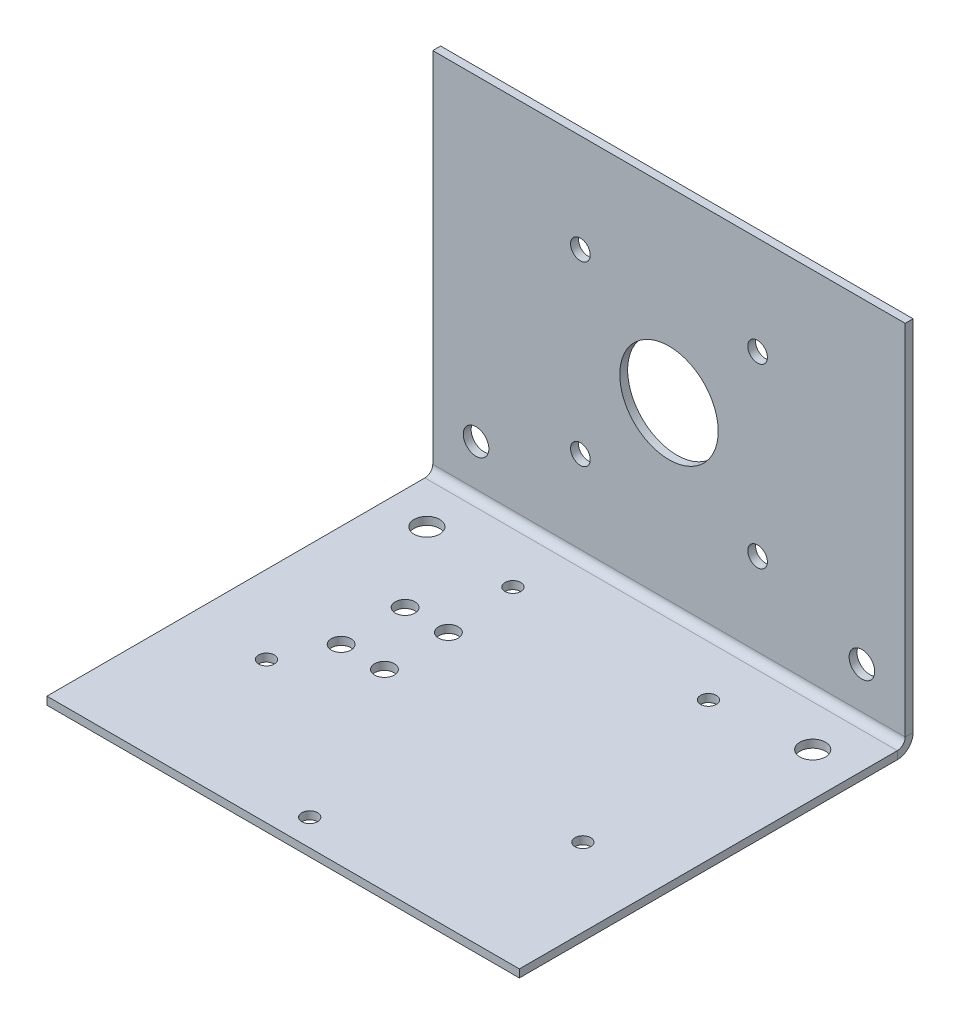
ISO-10303-21;
HEADER;
FILE_DESCRIPTION(('STEP AP214'),'2;1');
FILE_NAME('part.step','',(''),(''),'','','');
FILE_SCHEMA(('AUTOMOTIVE_DESIGN { 1 0 10303 214 1 1 1 1 }'));
ENDSEC;
DATA;
#1=APPLICATION_CONTEXT('core data for automotive mechanical design processes');
#2=APPLICATION_PROTOCOL_DEFINITION('international standard','automotive_design',2000,#1);
#3=PRODUCT_CONTEXT('',#1,'mechanical');
#4=PRODUCT('Part','Part','',(#3));
#5=PRODUCT_RELATED_PRODUCT_CATEGORY('part','',(#4));
#6=PRODUCT_DEFINITION_FORMATION('','',#4);
#7=PRODUCT_DEFINITION_CONTEXT('part definition',#1,'design');
#8=PRODUCT_DEFINITION('design','',#6,#7);
#9=PRODUCT_DEFINITION_SHAPE('','',#8);
#10=(LENGTH_UNIT() NAMED_UNIT(*) SI_UNIT(.MILLI.,.METRE.));
#11=(NAMED_UNIT(*) PLANE_ANGLE_UNIT() SI_UNIT($,.RADIAN.));
#12=(NAMED_UNIT(*) SI_UNIT($,.STERADIAN.) SOLID_ANGLE_UNIT());
#13=UNCERTAINTY_MEASURE_WITH_UNIT(LENGTH_MEASURE(1.E-05),#10,'distance_accuracy_value','');
#14=(GEOMETRIC_REPRESENTATION_CONTEXT(3) GLOBAL_UNCERTAINTY_ASSIGNED_CONTEXT((#13)) GLOBAL_UNIT_ASSIGNED_CONTEXT((#10,
#11,#12)) REPRESENTATION_CONTEXT('',''));
#15=CARTESIAN_POINT('',(0.,0.,0.));
#16=DIRECTION('',(0.,0.,1.));
#17=DIRECTION('',(1.,0.,0.));
#18=AXIS2_PLACEMENT_3D('',#15,#16,#17);
#19=CARTESIAN_POINT('',(120.,0.,-2.));
#20=DIRECTION('',(1.,0.,0.));
#21=DIRECTION('',(0.,0.,-1.));
#22=AXIS2_PLACEMENT_3D('',#19,#20,#21);
#23=PLANE('',#22);
#24=DIRECTION('',(0.,1.,0.));
#25=VECTOR('',#24,1.);
#26=CARTESIAN_POINT('',(120.,0.,0.));
#27=LINE('',#26,#25);
#28=CARTESIAN_POINT('',(120.,4.00000000000001,0.));
#29=VERTEX_POINT('',#28);
#30=CARTESIAN_POINT('',(120.,95.,0.));
#31=VERTEX_POINT('',#30);
#32=EDGE_CURVE('E130',#29,#31,#27,.T.);
#33=ORIENTED_EDGE('',*,*,#32,.F.);
#34=DIRECTION('',(0.,0.,-1.));
#35=VECTOR('',#34,1.);
#36=CARTESIAN_POINT('',(120.,4.00000000000001,0.));
#37=LINE('',#36,#35);
#38=CARTESIAN_POINT('',(120.,4.00000000000002,-2.00000000000001));
#39=VERTEX_POINT('',#38);
#40=EDGE_CURVE('E185',#29,#39,#37,.T.);
#41=ORIENTED_EDGE('',*,*,#40,.T.);
#42=DIRECTION('',(0.,1.,0.));
#43=VECTOR('',#42,1.);
#44=CARTESIAN_POINT('',(120.,0.,-2.));
#45=LINE('',#44,#43);
#46=CARTESIAN_POINT('',(120.,95.,-2.));
#47=VERTEX_POINT('',#46);
#48=EDGE_CURVE('E138',#39,#47,#45,.T.);
#49=ORIENTED_EDGE('',*,*,#48,.T.);
#50=DIRECTION('',(0.,0.,1.));
#51=VECTOR('',#50,1.);
#52=CARTESIAN_POINT('',(120.,95.,-2.));
#53=LINE('',#52,#51);
#54=EDGE_CURVE('E86',#47,#31,#53,.T.);
#55=ORIENTED_EDGE('',*,*,#54,.T.);
#56=EDGE_LOOP('',(#33,#41,#49,#55));
#57=FACE_BOUND('',#56,.T.);
#58=ADVANCED_FACE('F82',(#57),#23,.T.);
#59=CARTESIAN_POINT('',(0.,0.,-2.));
#60=DIRECTION('',(0.,0.,-1.));
#61=DIRECTION('',(-1.,0.,0.));
#62=AXIS2_PLACEMENT_3D('',#59,#60,#61);
#63=PLANE('',#62);
#64=CARTESIAN_POINT('',(109.,14.5,-2.));
#65=DIRECTION('',(0.,0.,1.));
#66=DIRECTION('',(-1.,0.,0.));
#67=AXIS2_PLACEMENT_3D('',#64,#65,#66);
#68=CIRCLE('',#67,3.25000000000001);
#69=CARTESIAN_POINT('',(105.75,14.5,-2.));
#70=VERTEX_POINT('',#69);
#71=EDGE_CURVE('E177',#70,#70,#68,.T.);
#72=ORIENTED_EDGE('',*,*,#71,.T.);
#73=EDGE_LOOP('',(#72));
#74=FACE_BOUND('',#73,.T.);
#75=CARTESIAN_POINT('',(11.,14.5,-2.));
#76=DIRECTION('',(0.,0.,1.));
#77=DIRECTION('',(1.,0.,0.));
#78=AXIS2_PLACEMENT_3D('',#75,#76,#77);
#79=CIRCLE('',#78,3.25);
#80=CARTESIAN_POINT('',(14.25,14.5,-2.));
#81=VERTEX_POINT('',#80);
#82=EDGE_CURVE('E171',#81,#81,#79,.T.);
#83=ORIENTED_EDGE('',*,*,#82,.T.);
#84=EDGE_LOOP('',(#83));
#85=FACE_BOUND('',#84,.T.);
#86=CARTESIAN_POINT('',(82.5,25.,-2.));
#87=DIRECTION('',(0.,0.,1.));
#88=DIRECTION('',(1.,0.,0.));
#89=AXIS2_PLACEMENT_3D('',#86,#87,#88);
#90=CIRCLE('',#89,2.49999999999999);
#91=CARTESIAN_POINT('',(85.,25.,-2.));
#92=VERTEX_POINT('',#91);
#93=EDGE_CURVE('E165',#92,#92,#90,.T.);
#94=ORIENTED_EDGE('',*,*,#93,.T.);
#95=EDGE_LOOP('',(#94));
#96=FACE_BOUND('',#95,.T.);
#97=CARTESIAN_POINT('',(37.5,25.,-2.));
#98=DIRECTION('',(0.,0.,1.));
#99=DIRECTION('',(1.,0.,0.));
#100=AXIS2_PLACEMENT_3D('',#97,#98,#99);
#101=CIRCLE('',#100,2.49999999999999);
#102=CARTESIAN_POINT('',(40.,25.,-2.));
#103=VERTEX_POINT('',#102);
#104=EDGE_CURVE('E159',#103,#103,#101,.T.);
#105=ORIENTED_EDGE('',*,*,#104,.T.);
#106=EDGE_LOOP('',(#105));
#107=FACE_BOUND('',#106,.T.);
#108=CARTESIAN_POINT('',(37.5,70.,-2.));
#109=DIRECTION('',(0.,0.,1.));
#110=DIRECTION('',(1.,0.,0.));
#111=AXIS2_PLACEMENT_3D('',#108,#109,#110);
#112=CIRCLE('',#111,2.5);
#113=CARTESIAN_POINT('',(40.,70.,-2.));
#114=VERTEX_POINT('',#113);
#115=EDGE_CURVE('E153',#114,#114,#112,.T.);
#116=ORIENTED_EDGE('',*,*,#115,.T.);
#117=EDGE_LOOP('',(#116));
#118=FACE_BOUND('',#117,.T.);
#119=CARTESIAN_POINT('',(82.5,70.,-2.));
#120=DIRECTION('',(0.,0.,1.));
#121=DIRECTION('',(1.,0.,0.));
#122=AXIS2_PLACEMENT_3D('',#119,#120,#121);
#123=CIRCLE('',#122,2.5);
#124=CARTESIAN_POINT('',(85.,70.,-2.));
#125=VERTEX_POINT('',#124);
#126=EDGE_CURVE('E147',#125,#125,#123,.T.);
#127=ORIENTED_EDGE('',*,*,#126,.T.);
#128=EDGE_LOOP('',(#127));
#129=FACE_BOUND('',#128,.T.);
#130=CARTESIAN_POINT('',(60.,47.5,-2.));
#131=DIRECTION('',(0.,0.,1.));
#132=DIRECTION('',(1.,0.,0.));
#133=AXIS2_PLACEMENT_3D('',#130,#131,#132);
#134=CIRCLE('',#133,12.5);
#135=CARTESIAN_POINT('',(72.5,47.5,-2.));
#136=VERTEX_POINT('',#135);
#137=EDGE_CURVE('E131',#136,#136,#134,.T.);
#138=ORIENTED_EDGE('',*,*,#137,.T.);
#139=EDGE_LOOP('',(#138));
#140=FACE_BOUND('',#139,.T.);
#141=ORIENTED_EDGE('',*,*,#48,.F.);
#142=DIRECTION('',(1.,0.,0.));
#143=VECTOR('',#142,1.);
#144=CARTESIAN_POINT('',(120.,4.00000000000002,-2.00000000000001));
#145=LINE('',#144,#143);
#146=CARTESIAN_POINT('',(0.,4.00000000000003,-2.));
#147=VERTEX_POINT('',#146);
#148=EDGE_CURVE('E202',#39,#147,#145,.F.);
#149=ORIENTED_EDGE('',*,*,#148,.T.);
#150=DIRECTION('',(0.,-1.,0.));
#151=VECTOR('',#150,1.);
#152=CARTESIAN_POINT('',(0.,0.,-2.));
#153=LINE('',#152,#151);
#154=CARTESIAN_POINT('',(0.,95.,-2.));
#155=VERTEX_POINT('',#154);
#156=EDGE_CURVE('E136',#155,#147,#153,.T.);
#157=ORIENTED_EDGE('',*,*,#156,.F.);
#158=DIRECTION('',(-1.,0.,0.));
#159=VECTOR('',#158,1.);
#160=CARTESIAN_POINT('',(0.,95.,-2.));
#161=LINE('',#160,#159);
#162=EDGE_CURVE('E122',#47,#155,#161,.T.);
#163=ORIENTED_EDGE('',*,*,#162,.F.);
#164=EDGE_LOOP('',(#141,#149,#157,#163));
#165=FACE_BOUND('',#164,.T.);
#166=ADVANCED_FACE('F358',(#74,#85,#96,#107,#118,#129,#140,#165),#63,.T.);
#167=CARTESIAN_POINT('',(0.,0.,0.));
#168=DIRECTION('',(0.,0.,-1.));
#169=DIRECTION('',(-1.,0.,0.));
#170=AXIS2_PLACEMENT_3D('',#167,#168,#169);
#171=PLANE('',#170);
#172=CARTESIAN_POINT('',(60.,47.5,0.));
#173=DIRECTION('',(0.,0.,1.));
#174=DIRECTION('',(1.,0.,0.));
#175=AXIS2_PLACEMENT_3D('',#172,#173,#174);
#176=CIRCLE('',#175,12.5);
#177=CARTESIAN_POINT('',(72.5,47.5,0.));
#178=VERTEX_POINT('',#177);
#179=EDGE_CURVE('E144',#178,#178,#176,.T.);
#180=ORIENTED_EDGE('',*,*,#179,.F.);
#181=EDGE_LOOP('',(#180));
#182=FACE_BOUND('',#181,.T.);
#183=CARTESIAN_POINT('',(82.5,70.,0.));
#184=DIRECTION('',(0.,0.,1.));
#185=DIRECTION('',(1.,0.,0.));
#186=AXIS2_PLACEMENT_3D('',#183,#184,#185);
#187=CIRCLE('',#186,2.5);
#188=CARTESIAN_POINT('',(85.,70.,0.));
#189=VERTEX_POINT('',#188);
#190=EDGE_CURVE('E150',#189,#189,#187,.T.);
#191=ORIENTED_EDGE('',*,*,#190,.F.);
#192=EDGE_LOOP('',(#191));
#193=FACE_BOUND('',#192,.T.);
#194=CARTESIAN_POINT('',(37.5,70.,0.));
#195=DIRECTION('',(0.,0.,1.));
#196=DIRECTION('',(1.,0.,0.));
#197=AXIS2_PLACEMENT_3D('',#194,#195,#196);
#198=CIRCLE('',#197,2.5);
#199=CARTESIAN_POINT('',(40.,70.,0.));
#200=VERTEX_POINT('',#199);
#201=EDGE_CURVE('E156',#200,#200,#198,.T.);
#202=ORIENTED_EDGE('',*,*,#201,.F.);
#203=EDGE_LOOP('',(#202));
#204=FACE_BOUND('',#203,.T.);
#205=CARTESIAN_POINT('',(37.5,25.,0.));
#206=DIRECTION('',(0.,0.,1.));
#207=DIRECTION('',(1.,0.,0.));
#208=AXIS2_PLACEMENT_3D('',#205,#206,#207);
#209=CIRCLE('',#208,2.49999999999999);
#210=CARTESIAN_POINT('',(40.,25.,0.));
#211=VERTEX_POINT('',#210);
#212=EDGE_CURVE('E162',#211,#211,#209,.T.);
#213=ORIENTED_EDGE('',*,*,#212,.F.);
#214=EDGE_LOOP('',(#213));
#215=FACE_BOUND('',#214,.T.);
#216=CARTESIAN_POINT('',(82.5,25.,0.));
#217=DIRECTION('',(0.,0.,1.));
#218=DIRECTION('',(1.,0.,0.));
#219=AXIS2_PLACEMENT_3D('',#216,#217,#218);
#220=CIRCLE('',#219,2.49999999999999);
#221=CARTESIAN_POINT('',(85.,25.,0.));
#222=VERTEX_POINT('',#221);
#223=EDGE_CURVE('E168',#222,#222,#220,.T.);
#224=ORIENTED_EDGE('',*,*,#223,.F.);
#225=EDGE_LOOP('',(#224));
#226=FACE_BOUND('',#225,.T.);
#227=CARTESIAN_POINT('',(11.,14.5,0.));
#228=DIRECTION('',(0.,0.,1.));
#229=DIRECTION('',(1.,0.,0.));
#230=AXIS2_PLACEMENT_3D('',#227,#228,#229);
#231=CIRCLE('',#230,3.25);
#232=CARTESIAN_POINT('',(14.25,14.5,0.));
#233=VERTEX_POINT('',#232);
#234=EDGE_CURVE('E174',#233,#233,#231,.T.);
#235=ORIENTED_EDGE('',*,*,#234,.F.);
#236=EDGE_LOOP('',(#235));
#237=FACE_BOUND('',#236,.T.);
#238=CARTESIAN_POINT('',(109.,14.5,0.));
#239=DIRECTION('',(0.,0.,1.));
#240=DIRECTION('',(-1.,0.,0.));
#241=AXIS2_PLACEMENT_3D('',#238,#239,#240);
#242=CIRCLE('',#241,3.25000000000001);
#243=CARTESIAN_POINT('',(105.75,14.5,0.));
#244=VERTEX_POINT('',#243);
#245=EDGE_CURVE('E180',#244,#244,#242,.T.);
#246=ORIENTED_EDGE('',*,*,#245,.F.);
#247=EDGE_LOOP('',(#246));
#248=FACE_BOUND('',#247,.T.);
#249=DIRECTION('',(1.,0.,0.));
#250=VECTOR('',#249,1.);
#251=CARTESIAN_POINT('',(120.,4.00000000000001,0.));
#252=LINE('',#251,#250);
#253=CARTESIAN_POINT('',(0.,4.00000000000001,0.));
#254=VERTEX_POINT('',#253);
#255=EDGE_CURVE('E192',#29,#254,#252,.F.);
#256=ORIENTED_EDGE('',*,*,#255,.F.);
#257=ORIENTED_EDGE('',*,*,#32,.T.);
#258=DIRECTION('',(-1.,0.,0.));
#259=VECTOR('',#258,1.);
#260=CARTESIAN_POINT('',(0.,95.,0.));
#261=LINE('',#260,#259);
#262=CARTESIAN_POINT('',(0.,95.,0.));
#263=VERTEX_POINT('',#262);
#264=EDGE_CURVE('E120',#31,#263,#261,.T.);
#265=ORIENTED_EDGE('',*,*,#264,.T.);
#266=DIRECTION('',(0.,-1.,0.));
#267=VECTOR('',#266,1.);
#268=CARTESIAN_POINT('',(0.,0.,0.));
#269=LINE('',#268,#267);
#270=EDGE_CURVE('E125',#263,#254,#269,.T.);
#271=ORIENTED_EDGE('',*,*,#270,.T.);
#272=EDGE_LOOP('',(#256,#257,#265,#271));
#273=FACE_BOUND('',#272,.T.);
#274=ADVANCED_FACE('F133',(#182,#193,#204,#215,#226,#237,#248,#273),#171,.F.);
#275=CARTESIAN_POINT('',(0.,0.,-2.));
#276=DIRECTION('',(-1.,0.,0.));
#277=DIRECTION('',(0.,0.,1.));
#278=AXIS2_PLACEMENT_3D('',#275,#276,#277);
#279=PLANE('',#278);
#280=DIRECTION('',(0.,0.,-1.));
#281=VECTOR('',#280,1.);
#282=CARTESIAN_POINT('',(0.,4.00000000000001,0.));
#283=LINE('',#282,#281);
#284=EDGE_CURVE('E127',#254,#147,#283,.T.);
#285=ORIENTED_EDGE('',*,*,#284,.F.);
#286=ORIENTED_EDGE('',*,*,#270,.F.);
#287=DIRECTION('',(0.,0.,1.));
#288=VECTOR('',#287,1.);
#289=CARTESIAN_POINT('',(0.,95.,-2.));
#290=LINE('',#289,#288);
#291=EDGE_CURVE('E13',#155,#263,#290,.T.);
#292=ORIENTED_EDGE('',*,*,#291,.F.);
#293=ORIENTED_EDGE('',*,*,#156,.T.);
#294=EDGE_LOOP('',(#285,#286,#292,#293));
#295=FACE_BOUND('',#294,.T.);
#296=ADVANCED_FACE('F84',(#295),#279,.T.);
#297=CARTESIAN_POINT('',(0.,95.,-2.));
#298=DIRECTION('',(0.,1.,0.));
#299=DIRECTION('',(0.,0.,1.));
#300=AXIS2_PLACEMENT_3D('',#297,#298,#299);
#301=PLANE('',#300);
#302=ORIENTED_EDGE('',*,*,#264,.F.);
#303=ORIENTED_EDGE('',*,*,#54,.F.);
#304=ORIENTED_EDGE('',*,*,#162,.T.);
#305=ORIENTED_EDGE('',*,*,#291,.T.);
#306=EDGE_LOOP('',(#302,#303,#304,#305));
#307=FACE_BOUND('',#306,.T.);
#308=ADVANCED_FACE('F117',(#307),#301,.T.);
#309=CARTESIAN_POINT('',(60.,47.5,-2.));
#310=DIRECTION('',(0.,0.,1.));
#311=DIRECTION('',(1.,0.,0.));
#312=AXIS2_PLACEMENT_3D('',#309,#310,#311);
#313=CYLINDRICAL_SURFACE('',#312,12.5);
#314=ORIENTED_EDGE('',*,*,#137,.F.);
#315=EDGE_LOOP('',(#314));
#316=FACE_BOUND('',#315,.T.);
#317=ORIENTED_EDGE('',*,*,#179,.T.);
#318=EDGE_LOOP('',(#317));
#319=FACE_BOUND('',#318,.T.);
#320=ADVANCED_FACE('F382',(#316,#319),#313,.F.);
#321=CARTESIAN_POINT('',(82.5,70.,-2.));
#322=DIRECTION('',(0.,0.,1.));
#323=DIRECTION('',(1.,0.,0.));
#324=AXIS2_PLACEMENT_3D('',#321,#322,#323);
#325=CYLINDRICAL_SURFACE('',#324,2.5);
#326=ORIENTED_EDGE('',*,*,#126,.F.);
#327=EDGE_LOOP('',(#326));
#328=FACE_BOUND('',#327,.T.);
#329=ORIENTED_EDGE('',*,*,#190,.T.);
#330=EDGE_LOOP('',(#329));
#331=FACE_BOUND('',#330,.T.);
#332=ADVANCED_FACE('F388',(#328,#331),#325,.F.);
#333=CARTESIAN_POINT('',(37.5,70.,-2.));
#334=DIRECTION('',(0.,0.,1.));
#335=DIRECTION('',(1.,0.,0.));
#336=AXIS2_PLACEMENT_3D('',#333,#334,#335);
#337=CYLINDRICAL_SURFACE('',#336,2.5);
#338=ORIENTED_EDGE('',*,*,#115,.F.);
#339=EDGE_LOOP('',(#338));
#340=FACE_BOUND('',#339,.T.);
#341=ORIENTED_EDGE('',*,*,#201,.T.);
#342=EDGE_LOOP('',(#341));
#343=FACE_BOUND('',#342,.T.);
#344=ADVANCED_FACE('F392',(#340,#343),#337,.F.);
#345=CARTESIAN_POINT('',(37.5,25.,-2.));
#346=DIRECTION('',(0.,0.,1.));
#347=DIRECTION('',(1.,0.,0.));
#348=AXIS2_PLACEMENT_3D('',#345,#346,#347);
#349=CYLINDRICAL_SURFACE('',#348,2.49999999999999);
#350=ORIENTED_EDGE('',*,*,#104,.F.);
#351=EDGE_LOOP('',(#350));
#352=FACE_BOUND('',#351,.T.);
#353=ORIENTED_EDGE('',*,*,#212,.T.);
#354=EDGE_LOOP('',(#353));
#355=FACE_BOUND('',#354,.T.);
#356=ADVANCED_FACE('F396',(#352,#355),#349,.F.);
#357=CARTESIAN_POINT('',(82.5,25.,-2.));
#358=DIRECTION('',(0.,0.,1.));
#359=DIRECTION('',(1.,0.,0.));
#360=AXIS2_PLACEMENT_3D('',#357,#358,#359);
#361=CYLINDRICAL_SURFACE('',#360,2.49999999999999);
#362=ORIENTED_EDGE('',*,*,#93,.F.);
#363=EDGE_LOOP('',(#362));
#364=FACE_BOUND('',#363,.T.);
#365=ORIENTED_EDGE('',*,*,#223,.T.);
#366=EDGE_LOOP('',(#365));
#367=FACE_BOUND('',#366,.T.);
#368=ADVANCED_FACE('F400',(#364,#367),#361,.F.);
#369=CARTESIAN_POINT('',(11.,14.5,-2.));
#370=DIRECTION('',(0.,0.,1.));
#371=DIRECTION('',(1.,0.,0.));
#372=AXIS2_PLACEMENT_3D('',#369,#370,#371);
#373=CYLINDRICAL_SURFACE('',#372,3.25);
#374=ORIENTED_EDGE('',*,*,#82,.F.);
#375=EDGE_LOOP('',(#374));
#376=FACE_BOUND('',#375,.T.);
#377=ORIENTED_EDGE('',*,*,#234,.T.);
#378=EDGE_LOOP('',(#377));
#379=FACE_BOUND('',#378,.T.);
#380=ADVANCED_FACE('F369',(#376,#379),#373,.F.);
#381=CARTESIAN_POINT('',(109.,14.5,-2.));
#382=DIRECTION('',(0.,0.,1.));
#383=DIRECTION('',(1.,0.,0.));
#384=AXIS2_PLACEMENT_3D('',#381,#382,#383);
#385=CYLINDRICAL_SURFACE('',#384,3.25000000000001);
#386=ORIENTED_EDGE('',*,*,#71,.F.);
#387=EDGE_LOOP('',(#386));
#388=FACE_BOUND('',#387,.T.);
#389=ORIENTED_EDGE('',*,*,#245,.T.);
#390=EDGE_LOOP('',(#389));
#391=FACE_BOUND('',#390,.T.);
#392=ADVANCED_FACE('F362',(#388,#391),#385,.F.);
#393=CARTESIAN_POINT('',(0.,4.,2.));
#394=DIRECTION('',(-1.,0.,0.));
#395=DIRECTION('',(0.,0.,1.));
#396=AXIS2_PLACEMENT_3D('',#393,#394,#395);
#397=PLANE('',#396);
#398=DIRECTION('',(0.,1.,0.));
#399=VECTOR('',#398,1.);
#400=CARTESIAN_POINT('',(0.,0.,1.99999999999999));
#401=LINE('',#400,#399);
#402=CARTESIAN_POINT('',(0.,1.99999999999999,1.99999999999999));
#403=VERTEX_POINT('',#402);
#404=CARTESIAN_POINT('',(0.,0.,1.99999999999998));
#405=VERTEX_POINT('',#404);
#406=EDGE_CURVE('E206',#403,#405,#401,.F.);
#407=ORIENTED_EDGE('',*,*,#406,.F.);
#408=CARTESIAN_POINT('',(0.,4.,2.));
#409=DIRECTION('',(1.,0.,0.));
#410=DIRECTION('',(0.,0.,-1.));
#411=AXIS2_PLACEMENT_3D('',#408,#409,#410);
#412=CIRCLE('',#411,2.00000000000001);
#413=EDGE_CURVE('E196',#254,#403,#412,.F.);
#414=ORIENTED_EDGE('',*,*,#413,.F.);
#415=ORIENTED_EDGE('',*,*,#284,.T.);
#416=CARTESIAN_POINT('',(0.,4.,2.));
#417=DIRECTION('',(1.,0.,0.));
#418=DIRECTION('',(0.,0.,-1.));
#419=AXIS2_PLACEMENT_3D('',#416,#417,#418);
#420=CIRCLE('',#419,4.00000000000001);
#421=EDGE_CURVE('E97',#147,#405,#420,.F.);
#422=ORIENTED_EDGE('',*,*,#421,.T.);
#423=EDGE_LOOP('',(#407,#414,#415,#422));
#424=FACE_BOUND('',#423,.T.);
#425=ADVANCED_FACE('F360',(#424),#397,.T.);
#426=CARTESIAN_POINT('',(120.,4.,2.));
#427=DIRECTION('',(-1.,0.,0.));
#428=DIRECTION('',(0.,0.,1.));
#429=AXIS2_PLACEMENT_3D('',#426,#427,#428);
#430=PLANE('',#429);
#431=CARTESIAN_POINT('',(120.,4.,2.));
#432=DIRECTION('',(1.,0.,0.));
#433=DIRECTION('',(0.,0.,-1.));
#434=AXIS2_PLACEMENT_3D('',#431,#432,#433);
#435=CIRCLE('',#434,2.00000000000001);
#436=CARTESIAN_POINT('',(120.,1.99999999999999,1.99999999999999));
#437=VERTEX_POINT('',#436);
#438=EDGE_CURVE('E189',#437,#29,#435,.T.);
#439=ORIENTED_EDGE('',*,*,#438,.F.);
#440=DIRECTION('',(0.,1.,0.));
#441=VECTOR('',#440,1.);
#442=CARTESIAN_POINT('',(120.,2.00000000000001,1.99999999999999));
#443=LINE('',#442,#441);
#444=CARTESIAN_POINT('',(120.,0.,1.99999999999998));
#445=VERTEX_POINT('',#444);
#446=EDGE_CURVE('E212',#437,#445,#443,.F.);
#447=ORIENTED_EDGE('',*,*,#446,.T.);
#448=CARTESIAN_POINT('',(120.,4.,2.));
#449=DIRECTION('',(1.,0.,0.));
#450=DIRECTION('',(0.,0.,-1.));
#451=AXIS2_PLACEMENT_3D('',#448,#449,#450);
#452=CIRCLE('',#451,4.00000000000001);
#453=EDGE_CURVE('E199',#445,#39,#452,.T.);
#454=ORIENTED_EDGE('',*,*,#453,.T.);
#455=ORIENTED_EDGE('',*,*,#40,.F.);
#456=EDGE_LOOP('',(#439,#447,#454,#455));
#457=FACE_BOUND('',#456,.T.);
#458=ADVANCED_FACE('F352',(#457),#430,.F.);
#459=CARTESIAN_POINT('',(120.,4.,2.));
#460=DIRECTION('',(1.,0.,0.));
#461=DIRECTION('',(0.,-1.,0.));
#462=AXIS2_PLACEMENT_3D('',#459,#460,#461);
#463=CYLINDRICAL_SURFACE('',#462,4.00000000000001);
#464=ORIENTED_EDGE('',*,*,#148,.F.);
#465=ORIENTED_EDGE('',*,*,#453,.F.);
#466=DIRECTION('',(1.,0.,0.));
#467=VECTOR('',#466,1.);
#468=CARTESIAN_POINT('',(0.,0.,1.99999999999999));
#469=LINE('',#468,#467);
#470=EDGE_CURVE('E215',#445,#405,#469,.F.);
#471=ORIENTED_EDGE('',*,*,#470,.T.);
#472=ORIENTED_EDGE('',*,*,#421,.F.);
#473=EDGE_LOOP('',(#464,#465,#471,#472));
#474=FACE_BOUND('',#473,.T.);
#475=ADVANCED_FACE('F359',(#474),#463,.T.);
#476=CARTESIAN_POINT('',(120.,4.,2.));
#477=DIRECTION('',(1.,0.,0.));
#478=DIRECTION('',(0.,-1.,0.));
#479=AXIS2_PLACEMENT_3D('',#476,#477,#478);
#480=CYLINDRICAL_SURFACE('',#479,2.00000000000001);
#481=ORIENTED_EDGE('',*,*,#255,.T.);
#482=ORIENTED_EDGE('',*,*,#413,.T.);
#483=DIRECTION('',(1.,0.,0.));
#484=VECTOR('',#483,1.);
#485=CARTESIAN_POINT('',(0.,1.99999999999999,1.99999999999999));
#486=LINE('',#485,#484);
#487=EDGE_CURVE('E209',#403,#437,#486,.T.);
#488=ORIENTED_EDGE('',*,*,#487,.T.);
#489=ORIENTED_EDGE('',*,*,#438,.T.);
#490=EDGE_LOOP('',(#481,#482,#488,#489));
#491=FACE_BOUND('',#490,.T.);
#492=ADVANCED_FACE('F354',(#491),#480,.F.);
#493=CARTESIAN_POINT('',(0.,0.,0.));
#494=DIRECTION('',(0.,1.,0.));
#495=DIRECTION('',(0.,0.,1.));
#496=AXIS2_PLACEMENT_3D('',#493,#494,#495);
#497=PLANE('',#496);
#498=CARTESIAN_POINT('',(25.98,-1.67448644347437E-13,49.25));
#499=DIRECTION('',(0.,1.,0.));
#500=DIRECTION('',(0.,0.,1.));
#501=AXIS2_PLACEMENT_3D('',#498,#499,#500);
#502=CIRCLE('',#501,2.50000000000001);
#503=CARTESIAN_POINT('',(25.98,-1.76177347694544E-13,51.75));
#504=VERTEX_POINT('',#503);
#505=EDGE_CURVE('E220',#504,#504,#502,.F.);
#506=ORIENTED_EDGE('',*,*,#505,.F.);
#507=EDGE_LOOP('',(#506));
#508=FACE_BOUND('',#507,.T.);
#509=CARTESIAN_POINT('',(36.98,-1.65540448523862E-13,49.25));
#510=DIRECTION('',(0.,1.,0.));
#511=DIRECTION('',(0.,0.,1.));
#512=AXIS2_PLACEMENT_3D('',#509,#510,#511);
#513=CIRCLE('',#512,2.5);
#514=CARTESIAN_POINT('',(36.98,-1.7426915187097E-13,51.75));
#515=VERTEX_POINT('',#514);
#516=EDGE_CURVE('E226',#515,#515,#513,.F.);
#517=ORIENTED_EDGE('',*,*,#516,.F.);
#518=EDGE_LOOP('',(#517));
#519=FACE_BOUND('',#518,.T.);
#520=CARTESIAN_POINT('',(25.98,-1.10712072591236E-13,33.));
#521=DIRECTION('',(0.,1.,0.));
#522=DIRECTION('',(0.,0.,1.));
#523=AXIS2_PLACEMENT_3D('',#520,#521,#522);
#524=CIRCLE('',#523,2.50000000000001);
#525=CARTESIAN_POINT('',(25.98,-1.19440775938344E-13,35.5));
#526=VERTEX_POINT('',#525);
#527=EDGE_CURVE('E232',#526,#526,#524,.F.);
#528=ORIENTED_EDGE('',*,*,#527,.F.);
#529=EDGE_LOOP('',(#528));
#530=FACE_BOUND('',#529,.T.);
#531=CARTESIAN_POINT('',(36.98,-1.08803876767661E-13,33.));
#532=DIRECTION('',(0.,1.,0.));
#533=DIRECTION('',(0.,0.,1.));
#534=AXIS2_PLACEMENT_3D('',#531,#532,#533);
#535=CIRCLE('',#534,2.5);
#536=CARTESIAN_POINT('',(36.98,-1.17532580114769E-13,35.5));
#537=VERTEX_POINT('',#536);
#538=EDGE_CURVE('E238',#537,#537,#535,.F.);
#539=ORIENTED_EDGE('',*,*,#538,.F.);
#540=EDGE_LOOP('',(#539));
#541=FACE_BOUND('',#540,.T.);
#542=CARTESIAN_POINT('',(11.,0.,12.5));
#543=DIRECTION('',(0.,1.,0.));
#544=DIRECTION('',(0.,0.,1.));
#545=AXIS2_PLACEMENT_3D('',#542,#543,#544);
#546=CIRCLE('',#545,3.25000000000001);
#547=CARTESIAN_POINT('',(11.,0.,15.75));
#548=VERTEX_POINT('',#547);
#549=EDGE_CURVE('E244',#548,#548,#546,.F.);
#550=ORIENTED_EDGE('',*,*,#549,.F.);
#551=EDGE_LOOP('',(#550));
#552=FACE_BOUND('',#551,.T.);
#553=CARTESIAN_POINT('',(109.,0.,12.5));
#554=DIRECTION('',(0.,1.,0.));
#555=DIRECTION('',(0.,0.,1.));
#556=AXIS2_PLACEMENT_3D('',#553,#554,#555);
#557=CIRCLE('',#556,3.25000000000001);
#558=CARTESIAN_POINT('',(109.,0.,15.75));
#559=VERTEX_POINT('',#558);
#560=EDGE_CURVE('E250',#559,#559,#557,.F.);
#561=ORIENTED_EDGE('',*,*,#560,.F.);
#562=EDGE_LOOP('',(#561));
#563=FACE_BOUND('',#562,.T.);
#564=CARTESIAN_POINT('',(19.8178621865298,-2.13229403201072E-13,62.0559680123415));
#565=DIRECTION('',(0.,1.,0.));
#566=DIRECTION('',(0.,0.,1.));
#567=AXIS2_PLACEMENT_3D('',#564,#565,#566);
#568=CIRCLE('',#567,2.);
#569=CARTESIAN_POINT('',(19.8178621865298,-2.20212365878758E-13,64.0559680123415));
#570=VERTEX_POINT('',#569);
#571=EDGE_CURVE('E256',#570,#570,#568,.F.);
#572=ORIENTED_EDGE('',*,*,#571,.F.);
#573=EDGE_LOOP('',(#572));
#574=FACE_BOUND('',#573,.T.);
#575=CARTESIAN_POINT('',(35.166073090643,0.,14.8190319876585));
#576=DIRECTION('',(0.,1.,0.));
#577=DIRECTION('',(0.,0.,1.));
#578=AXIS2_PLACEMENT_3D('',#575,#576,#577);
#579=CIRCLE('',#578,2.);
#580=CARTESIAN_POINT('',(35.166073090643,0.,16.8190319876585));
#581=VERTEX_POINT('',#580);
#582=EDGE_CURVE('E262',#581,#581,#579,.F.);
#583=ORIENTED_EDGE('',*,*,#582,.F.);
#584=EDGE_LOOP('',(#583));
#585=FACE_BOUND('',#584,.T.);
#586=CARTESIAN_POINT('',(84.833926909357,0.,14.8190319876585));
#587=DIRECTION('',(0.,1.,0.));
#588=DIRECTION('',(0.,0.,1.));
#589=AXIS2_PLACEMENT_3D('',#586,#587,#588);
#590=CIRCLE('',#589,2.);
#591=CARTESIAN_POINT('',(84.833926909357,0.,16.8190319876585));
#592=VERTEX_POINT('',#591);
#593=EDGE_CURVE('E268',#592,#592,#590,.F.);
#594=ORIENTED_EDGE('',*,*,#593,.F.);
#595=EDGE_LOOP('',(#594));
#596=FACE_BOUND('',#595,.T.);
#597=CARTESIAN_POINT('',(100.18213781347,-1.9928842364508E-13,62.0559680123415));
#598=DIRECTION('',(0.,1.,0.));
#599=DIRECTION('',(0.,0.,1.));
#600=AXIS2_PLACEMENT_3D('',#597,#598,#599);
#601=CIRCLE('',#600,2.);
#602=CARTESIAN_POINT('',(100.18213781347,-2.06271386322766E-13,64.0559680123415));
#603=VERTEX_POINT('',#602);
#604=EDGE_CURVE('E274',#603,#603,#601,.F.);
#605=ORIENTED_EDGE('',*,*,#604,.F.);
#606=EDGE_LOOP('',(#605));
#607=FACE_BOUND('',#606,.T.);
#608=CARTESIAN_POINT('',(60.,-3.08189331313575E-13,91.25));
#609=DIRECTION('',(0.,1.,0.));
#610=DIRECTION('',(0.,0.,1.));
#611=AXIS2_PLACEMENT_3D('',#608,#609,#610);
#612=CIRCLE('',#611,2.00000000000001);
#613=CARTESIAN_POINT('',(60.,-3.15172293991261E-13,93.25));
#614=VERTEX_POINT('',#613);
#615=EDGE_CURVE('E280',#614,#614,#612,.F.);
#616=ORIENTED_EDGE('',*,*,#615,.F.);
#617=EDGE_LOOP('',(#616));
#618=FACE_BOUND('',#617,.T.);
#619=ORIENTED_EDGE('',*,*,#470,.F.);
#620=DIRECTION('',(0.,0.,1.));
#621=VECTOR('',#620,1.);
#622=CARTESIAN_POINT('',(120.,0.,0.));
#623=LINE('',#622,#621);
#624=CARTESIAN_POINT('',(120.,-3.21348489494905E-13,98.));
#625=VERTEX_POINT('',#624);
#626=EDGE_CURVE('E295',#445,#625,#623,.T.);
#627=ORIENTED_EDGE('',*,*,#626,.T.);
#628=DIRECTION('',(-1.,0.,0.));
#629=VECTOR('',#628,1.);
#630=CARTESIAN_POINT('',(0.,-3.42165171206627E-13,98.));
#631=LINE('',#630,#629);
#632=CARTESIAN_POINT('',(0.,-3.42165171206627E-13,98.));
#633=VERTEX_POINT('',#632);
#634=EDGE_CURVE('E298',#625,#633,#631,.T.);
#635=ORIENTED_EDGE('',*,*,#634,.T.);
#636=DIRECTION('',(0.,0.,-1.));
#637=VECTOR('',#636,1.);
#638=CARTESIAN_POINT('',(0.,0.,0.));
#639=LINE('',#638,#637);
#640=EDGE_CURVE('E292',#633,#405,#639,.T.);
#641=ORIENTED_EDGE('',*,*,#640,.T.);
#642=EDGE_LOOP('',(#619,#627,#635,#641));
#643=FACE_BOUND('',#642,.T.);
#644=ADVANCED_FACE('F347',(#508,#519,#530,#541,#552,#563,#574,#585,#596,#607,#618,#643),#497,.F.);
#645=CARTESIAN_POINT('',(0.,2.,0.));
#646=DIRECTION('',(0.,1.,0.));
#647=DIRECTION('',(0.,0.,1.));
#648=AXIS2_PLACEMENT_3D('',#645,#646,#647);
#649=PLANE('',#648);
#650=CARTESIAN_POINT('',(36.98,1.99999999999983,49.25));
#651=DIRECTION('',(0.,1.,0.));
#652=DIRECTION('',(0.,0.,1.));
#653=AXIS2_PLACEMENT_3D('',#650,#651,#652);
#654=CIRCLE('',#653,2.5);
#655=CARTESIAN_POINT('',(36.98,1.99999999999983,51.75));
#656=VERTEX_POINT('',#655);
#657=EDGE_CURVE('E223',#656,#656,#654,.F.);
#658=ORIENTED_EDGE('',*,*,#657,.T.);
#659=EDGE_LOOP('',(#658));
#660=FACE_BOUND('',#659,.T.);
#661=CARTESIAN_POINT('',(36.98,1.99999999999989,33.));
#662=DIRECTION('',(0.,1.,0.));
#663=DIRECTION('',(0.,0.,1.));
#664=AXIS2_PLACEMENT_3D('',#661,#662,#663);
#665=CIRCLE('',#664,2.5);
#666=CARTESIAN_POINT('',(36.98,1.99999999999988,35.5));
#667=VERTEX_POINT('',#666);
#668=EDGE_CURVE('E235',#667,#667,#665,.F.);
#669=ORIENTED_EDGE('',*,*,#668,.T.);
#670=EDGE_LOOP('',(#669));
#671=FACE_BOUND('',#670,.T.);
#672=CARTESIAN_POINT('',(109.,1.99999999999998,12.5));
#673=DIRECTION('',(0.,1.,0.));
#674=DIRECTION('',(0.,0.,1.));
#675=AXIS2_PLACEMENT_3D('',#672,#673,#674);
#676=CIRCLE('',#675,3.25000000000001);
#677=CARTESIAN_POINT('',(109.,1.99999999999996,15.75));
#678=VERTEX_POINT('',#677);
#679=EDGE_CURVE('E247',#678,#678,#676,.F.);
#680=ORIENTED_EDGE('',*,*,#679,.T.);
#681=EDGE_LOOP('',(#680));
#682=FACE_BOUND('',#681,.T.);
#683=CARTESIAN_POINT('',(35.166073090643,1.99999999999995,14.8190319876585));
#684=DIRECTION('',(0.,1.,0.));
#685=DIRECTION('',(0.,0.,1.));
#686=AXIS2_PLACEMENT_3D('',#683,#684,#685);
#687=CIRCLE('',#686,2.);
#688=CARTESIAN_POINT('',(35.166073090643,1.99999999999995,16.8190319876585));
#689=VERTEX_POINT('',#688);
#690=EDGE_CURVE('E259',#689,#689,#687,.F.);
#691=ORIENTED_EDGE('',*,*,#690,.T.);
#692=EDGE_LOOP('',(#691));
#693=FACE_BOUND('',#692,.T.);
#694=CARTESIAN_POINT('',(100.18213781347,1.9999999999998,62.0559680123415));
#695=DIRECTION('',(0.,1.,0.));
#696=DIRECTION('',(0.,0.,1.));
#697=AXIS2_PLACEMENT_3D('',#694,#695,#696);
#698=CIRCLE('',#697,2.);
#699=CARTESIAN_POINT('',(100.18213781347,1.99999999999979,64.0559680123415));
#700=VERTEX_POINT('',#699);
#701=EDGE_CURVE('E271',#700,#700,#698,.F.);
#702=ORIENTED_EDGE('',*,*,#701,.T.);
#703=EDGE_LOOP('',(#702));
#704=FACE_BOUND('',#703,.T.);
#705=CARTESIAN_POINT('',(60.,1.99999999999969,91.25));
#706=DIRECTION('',(0.,1.,0.));
#707=DIRECTION('',(0.,0.,1.));
#708=AXIS2_PLACEMENT_3D('',#705,#706,#707);
#709=CIRCLE('',#708,2.00000000000001);
#710=CARTESIAN_POINT('',(60.,1.99999999999968,93.25));
#711=VERTEX_POINT('',#710);
#712=EDGE_CURVE('E277',#711,#711,#709,.F.);
#713=ORIENTED_EDGE('',*,*,#712,.T.);
#714=EDGE_LOOP('',(#713));
#715=FACE_BOUND('',#714,.T.);
#716=CARTESIAN_POINT('',(84.833926909357,1.99999999999996,14.8190319876585));
#717=DIRECTION('',(0.,1.,0.));
#718=DIRECTION('',(0.,0.,1.));
#719=AXIS2_PLACEMENT_3D('',#716,#717,#718);
#720=CIRCLE('',#719,2.);
#721=CARTESIAN_POINT('',(84.833926909357,1.99999999999996,16.8190319876585));
#722=VERTEX_POINT('',#721);
#723=EDGE_CURVE('E265',#722,#722,#720,.F.);
#724=ORIENTED_EDGE('',*,*,#723,.T.);
#725=EDGE_LOOP('',(#724));
#726=FACE_BOUND('',#725,.T.);
#727=CARTESIAN_POINT('',(19.8178621865298,1.99999999999979,62.0559680123415));
#728=DIRECTION('',(0.,1.,0.));
#729=DIRECTION('',(0.,0.,1.));
#730=AXIS2_PLACEMENT_3D('',#727,#728,#729);
#731=CIRCLE('',#730,2.);
#732=CARTESIAN_POINT('',(19.8178621865298,1.99999999999978,64.0559680123415));
#733=VERTEX_POINT('',#732);
#734=EDGE_CURVE('E253',#733,#733,#731,.F.);
#735=ORIENTED_EDGE('',*,*,#734,.T.);
#736=EDGE_LOOP('',(#735));
#737=FACE_BOUND('',#736,.T.);
#738=CARTESIAN_POINT('',(11.,1.99999999999996,12.5));
#739=DIRECTION('',(0.,1.,0.));
#740=DIRECTION('',(0.,0.,1.));
#741=AXIS2_PLACEMENT_3D('',#738,#739,#740);
#742=CIRCLE('',#741,3.25000000000001);
#743=CARTESIAN_POINT('',(11.,1.99999999999995,15.75));
#744=VERTEX_POINT('',#743);
#745=EDGE_CURVE('E241',#744,#744,#742,.F.);
#746=ORIENTED_EDGE('',*,*,#745,.T.);
#747=EDGE_LOOP('',(#746));
#748=FACE_BOUND('',#747,.T.);
#749=CARTESIAN_POINT('',(25.98,1.99999999999989,33.));
#750=DIRECTION('',(0.,1.,0.));
#751=DIRECTION('',(0.,0.,1.));
#752=AXIS2_PLACEMENT_3D('',#749,#750,#751);
#753=CIRCLE('',#752,2.50000000000001);
#754=CARTESIAN_POINT('',(25.98,1.99999999999988,35.5));
#755=VERTEX_POINT('',#754);
#756=EDGE_CURVE('E229',#755,#755,#753,.F.);
#757=ORIENTED_EDGE('',*,*,#756,.T.);
#758=EDGE_LOOP('',(#757));
#759=FACE_BOUND('',#758,.T.);
#760=CARTESIAN_POINT('',(25.98,1.99999999999983,49.25));
#761=DIRECTION('',(0.,1.,0.));
#762=DIRECTION('',(0.,0.,1.));
#763=AXIS2_PLACEMENT_3D('',#760,#761,#762);
#764=CIRCLE('',#763,2.50000000000001);
#765=CARTESIAN_POINT('',(25.98,1.99999999999982,51.75));
#766=VERTEX_POINT('',#765);
#767=EDGE_CURVE('E217',#766,#766,#764,.F.);
#768=ORIENTED_EDGE('',*,*,#767,.T.);
#769=EDGE_LOOP('',(#768));
#770=FACE_BOUND('',#769,.T.);
#771=DIRECTION('',(0.,0.,-1.));
#772=VECTOR('',#771,1.);
#773=CARTESIAN_POINT('',(120.,1.99999999999968,98.));
#774=LINE('',#773,#772);
#775=CARTESIAN_POINT('',(120.,1.99999999999968,98.));
#776=VERTEX_POINT('',#775);
#777=EDGE_CURVE('E286',#437,#776,#774,.F.);
#778=ORIENTED_EDGE('',*,*,#777,.F.);
#779=ORIENTED_EDGE('',*,*,#487,.F.);
#780=DIRECTION('',(0.,0.,1.));
#781=VECTOR('',#780,1.);
#782=CARTESIAN_POINT('',(0.,2.,0.));
#783=LINE('',#782,#781);
#784=CARTESIAN_POINT('',(0.,1.99999999999966,98.));
#785=VERTEX_POINT('',#784);
#786=EDGE_CURVE('E283',#785,#403,#783,.F.);
#787=ORIENTED_EDGE('',*,*,#786,.F.);
#788=DIRECTION('',(1.,0.,0.));
#789=VECTOR('',#788,1.);
#790=CARTESIAN_POINT('',(0.,1.99999999999966,98.));
#791=LINE('',#790,#789);
#792=EDGE_CURVE('E289',#776,#785,#791,.F.);
#793=ORIENTED_EDGE('',*,*,#792,.F.);
#794=EDGE_LOOP('',(#778,#779,#787,#793));
#795=FACE_BOUND('',#794,.T.);
#796=ADVANCED_FACE('F321',(#660,#671,#682,#693,#704,#715,#726,#737,#748,#759,#770,#795),#649,.T.);
#797=CARTESIAN_POINT('',(0.,0.,0.));
#798=DIRECTION('',(1.,0.,0.));
#799=DIRECTION('',(0.,1.,0.));
#800=AXIS2_PLACEMENT_3D('',#797,#798,#799);
#801=PLANE('',#800);
#802=ORIENTED_EDGE('',*,*,#406,.T.);
#803=ORIENTED_EDGE('',*,*,#640,.F.);
#804=DIRECTION('',(0.,1.,0.));
#805=VECTOR('',#804,1.);
#806=CARTESIAN_POINT('',(0.,-3.42165171206627E-13,98.));
#807=LINE('',#806,#805);
#808=EDGE_CURVE('E301',#633,#785,#807,.T.);
#809=ORIENTED_EDGE('',*,*,#808,.T.);
#810=ORIENTED_EDGE('',*,*,#786,.T.);
#811=EDGE_LOOP('',(#802,#803,#809,#810));
#812=FACE_BOUND('',#811,.T.);
#813=ADVANCED_FACE('F327',(#812),#801,.F.);
#814=CARTESIAN_POINT('',(120.,-3.21357523924704E-13,98.));
#815=DIRECTION('',(-1.,0.,0.));
#816=DIRECTION('',(0.,0.,1.));
#817=AXIS2_PLACEMENT_3D('',#814,#815,#816);
#818=PLANE('',#817);
#819=ORIENTED_EDGE('',*,*,#446,.F.);
#820=ORIENTED_EDGE('',*,*,#777,.T.);
#821=DIRECTION('',(0.,1.,0.));
#822=VECTOR('',#821,1.);
#823=CARTESIAN_POINT('',(120.,-3.21357523924704E-13,98.));
#824=LINE('',#823,#822);
#825=EDGE_CURVE('E193',#625,#776,#824,.T.);
#826=ORIENTED_EDGE('',*,*,#825,.F.);
#827=ORIENTED_EDGE('',*,*,#626,.F.);
#828=EDGE_LOOP('',(#819,#820,#826,#827));
#829=FACE_BOUND('',#828,.T.);
#830=ADVANCED_FACE('F349',(#829),#818,.F.);
#831=CARTESIAN_POINT('',(0.,-3.42174205636425E-13,98.));
#832=DIRECTION('',(0.,0.,-1.));
#833=DIRECTION('',(0.,1.,0.));
#834=AXIS2_PLACEMENT_3D('',#831,#832,#833);
#835=PLANE('',#834);
#836=ORIENTED_EDGE('',*,*,#792,.T.);
#837=ORIENTED_EDGE('',*,*,#808,.F.);
#838=ORIENTED_EDGE('',*,*,#634,.F.);
#839=ORIENTED_EDGE('',*,*,#825,.T.);
#840=EDGE_LOOP('',(#836,#837,#838,#839));
#841=FACE_BOUND('',#840,.T.);
#842=ADVANCED_FACE('F310',(#841),#835,.F.);
#843=CARTESIAN_POINT('',(60.,-3.08347097854877E-13,91.25));
#844=DIRECTION('',(0.,1.,0.));
#845=DIRECTION('',(0.,0.,1.));
#846=AXIS2_PLACEMENT_3D('',#843,#844,#845);
#847=CYLINDRICAL_SURFACE('',#846,2.00000000000001);
#848=ORIENTED_EDGE('',*,*,#615,.T.);
#849=EDGE_LOOP('',(#848));
#850=FACE_BOUND('',#849,.T.);
#851=ORIENTED_EDGE('',*,*,#712,.F.);
#852=EDGE_LOOP('',(#851));
#853=FACE_BOUND('',#852,.T.);
#854=ADVANCED_FACE('F553',(#850,#853),#847,.F.);
#855=CARTESIAN_POINT('',(100.18213781347,-1.99493199737333E-13,62.0559680123415));
#856=DIRECTION('',(0.,1.,0.));
#857=DIRECTION('',(0.,0.,1.));
#858=AXIS2_PLACEMENT_3D('',#855,#856,#857);
#859=CYLINDRICAL_SURFACE('',#858,2.);
#860=ORIENTED_EDGE('',*,*,#604,.T.);
#861=EDGE_LOOP('',(#860));
#862=FACE_BOUND('',#861,.T.);
#863=ORIENTED_EDGE('',*,*,#701,.F.);
#864=EDGE_LOOP('',(#863));
#865=FACE_BOUND('',#864,.T.);
#866=ADVANCED_FACE('F563',(#862,#865),#859,.F.);
#867=CARTESIAN_POINT('',(84.833926909357,0.,14.8190319876585));
#868=DIRECTION('',(0.,1.,0.));
#869=DIRECTION('',(0.,0.,1.));
#870=AXIS2_PLACEMENT_3D('',#867,#868,#869);
#871=CYLINDRICAL_SURFACE('',#870,2.);
#872=ORIENTED_EDGE('',*,*,#593,.T.);
#873=EDGE_LOOP('',(#872));
#874=FACE_BOUND('',#873,.T.);
#875=ORIENTED_EDGE('',*,*,#723,.F.);
#876=EDGE_LOOP('',(#875));
#877=FACE_BOUND('',#876,.T.);
#878=ADVANCED_FACE('F574',(#874,#877),#871,.F.);
#879=CARTESIAN_POINT('',(35.166073090643,0.,14.8190319876585));
#880=DIRECTION('',(0.,1.,0.));
#881=DIRECTION('',(0.,0.,1.));
#882=AXIS2_PLACEMENT_3D('',#879,#880,#881);
#883=CYLINDRICAL_SURFACE('',#882,2.);
#884=ORIENTED_EDGE('',*,*,#582,.T.);
#885=EDGE_LOOP('',(#884));
#886=FACE_BOUND('',#885,.T.);
#887=ORIENTED_EDGE('',*,*,#690,.F.);
#888=EDGE_LOOP('',(#887));
#889=FACE_BOUND('',#888,.T.);
#890=ADVANCED_FACE('F585',(#886,#889),#883,.F.);
#891=CARTESIAN_POINT('',(19.8178621865298,-2.13370987545147E-13,62.0559680123415));
#892=DIRECTION('',(0.,1.,0.));
#893=DIRECTION('',(0.,0.,1.));
#894=AXIS2_PLACEMENT_3D('',#891,#892,#893);
#895=CYLINDRICAL_SURFACE('',#894,2.);
#896=ORIENTED_EDGE('',*,*,#571,.T.);
#897=EDGE_LOOP('',(#896));
#898=FACE_BOUND('',#897,.T.);
#899=ORIENTED_EDGE('',*,*,#734,.F.);
#900=EDGE_LOOP('',(#899));
#901=FACE_BOUND('',#900,.T.);
#902=ADVANCED_FACE('F596',(#898,#901),#895,.F.);
#903=CARTESIAN_POINT('',(109.,0.,12.5));
#904=DIRECTION('',(0.,1.,0.));
#905=DIRECTION('',(0.,0.,1.));
#906=AXIS2_PLACEMENT_3D('',#903,#904,#905);
#907=CYLINDRICAL_SURFACE('',#906,3.25000000000001);
#908=ORIENTED_EDGE('',*,*,#560,.T.);
#909=EDGE_LOOP('',(#908));
#910=FACE_BOUND('',#909,.T.);
#911=ORIENTED_EDGE('',*,*,#679,.F.);
#912=EDGE_LOOP('',(#911));
#913=FACE_BOUND('',#912,.T.);
#914=ADVANCED_FACE('F607',(#910,#913),#907,.F.);
#915=CARTESIAN_POINT('',(11.,0.,12.5));
#916=DIRECTION('',(0.,1.,0.));
#917=DIRECTION('',(0.,0.,1.));
#918=AXIS2_PLACEMENT_3D('',#915,#916,#917);
#919=CYLINDRICAL_SURFACE('',#918,3.25000000000001);
#920=ORIENTED_EDGE('',*,*,#549,.T.);
#921=EDGE_LOOP('',(#920));
#922=FACE_BOUND('',#921,.T.);
#923=ORIENTED_EDGE('',*,*,#745,.F.);
#924=EDGE_LOOP('',(#923));
#925=FACE_BOUND('',#924,.T.);
#926=ADVANCED_FACE('F618',(#922,#925),#919,.F.);
#927=CARTESIAN_POINT('',(36.98,-1.08853898117545E-13,33.));
#928=DIRECTION('',(0.,1.,0.));
#929=DIRECTION('',(0.,0.,1.));
#930=AXIS2_PLACEMENT_3D('',#927,#928,#929);
#931=CYLINDRICAL_SURFACE('',#930,2.5);
#932=ORIENTED_EDGE('',*,*,#538,.T.);
#933=EDGE_LOOP('',(#932));
#934=FACE_BOUND('',#933,.T.);
#935=ORIENTED_EDGE('',*,*,#668,.F.);
#936=EDGE_LOOP('',(#935));
#937=FACE_BOUND('',#936,.T.);
#938=ADVANCED_FACE('F629',(#934,#937),#931,.F.);
#939=CARTESIAN_POINT('',(25.98,-1.10588621593521E-13,33.));
#940=DIRECTION('',(0.,1.,0.));
#941=DIRECTION('',(0.,0.,1.));
#942=AXIS2_PLACEMENT_3D('',#939,#940,#941);
#943=CYLINDRICAL_SURFACE('',#942,2.50000000000001);
#944=ORIENTED_EDGE('',*,*,#527,.T.);
#945=EDGE_LOOP('',(#944));
#946=FACE_BOUND('',#945,.T.);
#947=ORIENTED_EDGE('',*,*,#756,.F.);
#948=EDGE_LOOP('',(#947));
#949=FACE_BOUND('',#948,.T.);
#950=ADVANCED_FACE('F640',(#946,#949),#943,.F.);
#951=CARTESIAN_POINT('',(36.98,-1.65666091955785E-13,49.25));
#952=DIRECTION('',(0.,1.,0.));
#953=DIRECTION('',(0.,0.,1.));
#954=AXIS2_PLACEMENT_3D('',#951,#952,#953);
#955=CYLINDRICAL_SURFACE('',#954,2.5);
#956=ORIENTED_EDGE('',*,*,#516,.T.);
#957=EDGE_LOOP('',(#956));
#958=FACE_BOUND('',#957,.T.);
#959=ORIENTED_EDGE('',*,*,#657,.F.);
#960=EDGE_LOOP('',(#959));
#961=FACE_BOUND('',#960,.T.);
#962=ADVANCED_FACE('F651',(#958,#961),#955,.F.);
#963=CARTESIAN_POINT('',(25.98,-1.67400815431762E-13,49.25));
#964=DIRECTION('',(0.,1.,0.));
#965=DIRECTION('',(0.,0.,1.));
#966=AXIS2_PLACEMENT_3D('',#963,#964,#965);
#967=CYLINDRICAL_SURFACE('',#966,2.50000000000001);
#968=ORIENTED_EDGE('',*,*,#505,.T.);
#969=EDGE_LOOP('',(#968));
#970=FACE_BOUND('',#969,.T.);
#971=ORIENTED_EDGE('',*,*,#767,.F.);
#972=EDGE_LOOP('',(#971));
#973=FACE_BOUND('',#972,.T.);
#974=ADVANCED_FACE('F662',(#970,#973),#967,.F.);
#975=CLOSED_SHELL('',(#58,#166,#274,#296,#308,#320,#332,#344,#356,#368,#380,#392,#425,#458,#475,
#492,#644,#796,#813,#830,#842,#854,#866,#878,#890,#902,#914,#926,#938,#950,#962,#974));
#976=MANIFOLD_SOLID_BREP('B2',#975);
#977=ADVANCED_BREP_SHAPE_REPRESENTATION('',(#18,#976),#14);
#978=SHAPE_DEFINITION_REPRESENTATION(#9,#977);
ENDSEC;
END-ISO-10303-21;
